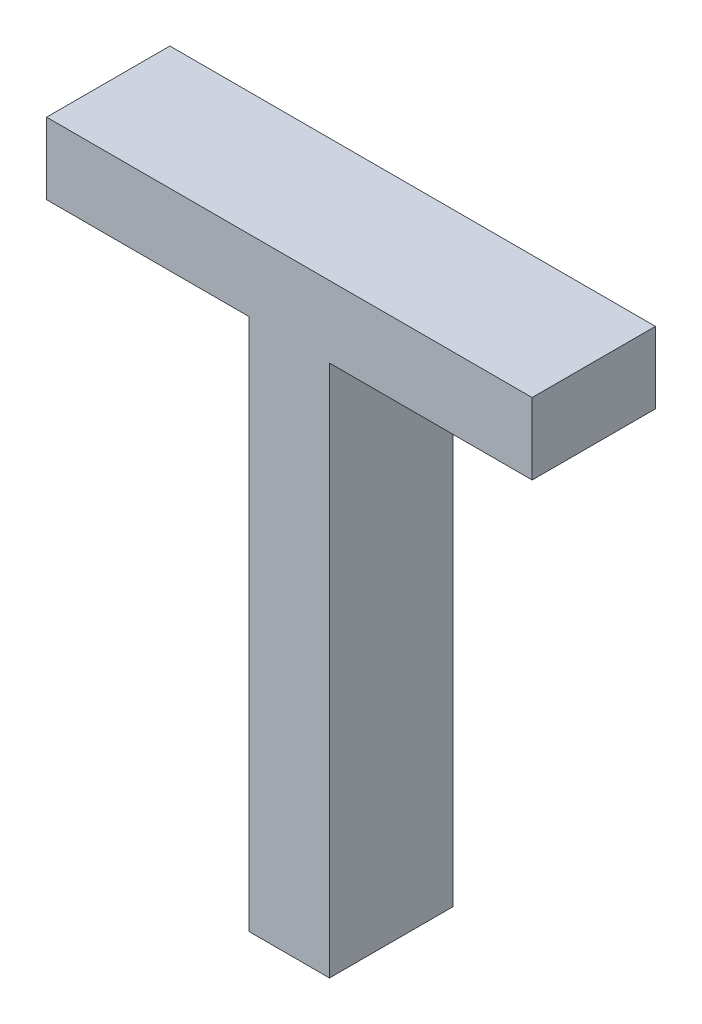
ISO-10303-21;
HEADER;
FILE_DESCRIPTION(('STEP AP214'),'2;1');
FILE_NAME('part.step','',(''),(''),'','','');
FILE_SCHEMA(('AUTOMOTIVE_DESIGN { 1 0 10303 214 1 1 1 1 }'));
ENDSEC;
DATA;
#1=APPLICATION_CONTEXT('core data for automotive mechanical design processes');
#2=APPLICATION_PROTOCOL_DEFINITION('international standard','automotive_design',2000,#1);
#3=PRODUCT_CONTEXT('',#1,'mechanical');
#4=PRODUCT('Part','Part','',(#3));
#5=PRODUCT_RELATED_PRODUCT_CATEGORY('part','',(#4));
#6=PRODUCT_DEFINITION_FORMATION('','',#4);
#7=PRODUCT_DEFINITION_CONTEXT('part definition',#1,'design');
#8=PRODUCT_DEFINITION('design','',#6,#7);
#9=PRODUCT_DEFINITION_SHAPE('','',#8);
#10=(LENGTH_UNIT() NAMED_UNIT(*) SI_UNIT(.MILLI.,.METRE.));
#11=(NAMED_UNIT(*) PLANE_ANGLE_UNIT() SI_UNIT($,.RADIAN.));
#12=(NAMED_UNIT(*) SI_UNIT($,.STERADIAN.) SOLID_ANGLE_UNIT());
#13=UNCERTAINTY_MEASURE_WITH_UNIT(LENGTH_MEASURE(1.E-05),#10,'distance_accuracy_value','');
#14=(GEOMETRIC_REPRESENTATION_CONTEXT(3) GLOBAL_UNCERTAINTY_ASSIGNED_CONTEXT((#13)) GLOBAL_UNIT_ASSIGNED_CONTEXT((#10,
#11,#12)) REPRESENTATION_CONTEXT('',''));
#15=CARTESIAN_POINT('',(0.,0.,0.));
#16=DIRECTION('',(0.,0.,1.));
#17=DIRECTION('',(1.,0.,0.));
#18=AXIS2_PLACEMENT_3D('',#15,#16,#17);
#19=CARTESIAN_POINT('',(-1.06893357572,-0.89500541970053,0.));
#20=DIRECTION('',(0.,-1.,0.));
#21=DIRECTION('',(1.,0.,0.));
#22=AXIS2_PLACEMENT_3D('',#19,#20,#21);
#23=PLANE('',#22);
#24=DIRECTION('',(-1.,0.,0.));
#25=VECTOR('',#24,1.);
#26=CARTESIAN_POINT('',(-0.904541359597708,-0.89500541970053,0.));
#27=LINE('',#26,#25);
#28=CARTESIAN_POINT('',(-0.904541359597708,-0.89500541970053,0.));
#29=VERTEX_POINT('',#28);
#30=CARTESIAN_POINT('',(-1.06893357572,-0.89500541970053,0.));
#31=VERTEX_POINT('',#30);
#32=EDGE_CURVE('E11',#29,#31,#27,.T.);
#33=ORIENTED_EDGE('',*,*,#32,.F.);
#34=DIRECTION('',(0.,0.,1.));
#35=VECTOR('',#34,1.);
#36=CARTESIAN_POINT('',(-0.904541359597708,-0.89500541970053,0.));
#37=LINE('',#36,#35);
#38=CARTESIAN_POINT('',(-0.904541359597708,-0.89500541970053,0.1));
#39=VERTEX_POINT('',#38);
#40=EDGE_CURVE('E24',#29,#39,#37,.T.);
#41=ORIENTED_EDGE('',*,*,#40,.T.);
#42=DIRECTION('',(1.,0.,0.));
#43=VECTOR('',#42,1.);
#44=CARTESIAN_POINT('',(-0.904541359597708,-0.89500541970053,0.1));
#45=LINE('',#44,#43);
#46=CARTESIAN_POINT('',(-1.06893357572,-0.89500541970053,0.1));
#47=VERTEX_POINT('',#46);
#48=EDGE_CURVE('E100',#47,#39,#45,.T.);
#49=ORIENTED_EDGE('',*,*,#48,.F.);
#50=DIRECTION('',(0.,0.,1.));
#51=VECTOR('',#50,1.);
#52=CARTESIAN_POINT('',(-1.06893357572,-0.89500541970053,0.));
#53=LINE('',#52,#51);
#54=EDGE_CURVE('E141',#31,#47,#53,.T.);
#55=ORIENTED_EDGE('',*,*,#54,.F.);
#56=EDGE_LOOP('',(#33,#41,#49,#55));
#57=FACE_BOUND('',#56,.T.);
#58=ADVANCED_FACE('F17',(#57),#23,.T.);
#59=CARTESIAN_POINT('',(-1.06893357572,-0.837031353145417,0.));
#60=DIRECTION('',(-1.,0.,0.));
#61=DIRECTION('',(0.,-1.,0.));
#62=AXIS2_PLACEMENT_3D('',#59,#60,#61);
#63=PLANE('',#62);
#64=DIRECTION('',(0.,1.,0.));
#65=VECTOR('',#64,1.);
#66=CARTESIAN_POINT('',(-1.06893357572,-0.89500541970053,0.));
#67=LINE('',#66,#65);
#68=CARTESIAN_POINT('',(-1.06893357572,-0.837031353145417,0.));
#69=VERTEX_POINT('',#68);
#70=EDGE_CURVE('E139',#31,#69,#67,.T.);
#71=ORIENTED_EDGE('',*,*,#70,.F.);
#72=ORIENTED_EDGE('',*,*,#54,.T.);
#73=DIRECTION('',(0.,-1.,0.));
#74=VECTOR('',#73,1.);
#75=CARTESIAN_POINT('',(-1.06893357572,-0.89500541970053,0.1));
#76=LINE('',#75,#74);
#77=CARTESIAN_POINT('',(-1.06893357572,-0.837031353145417,0.1));
#78=VERTEX_POINT('',#77);
#79=EDGE_CURVE('E137',#78,#47,#76,.T.);
#80=ORIENTED_EDGE('',*,*,#79,.F.);
#81=DIRECTION('',(0.,0.,1.));
#82=VECTOR('',#81,1.);
#83=CARTESIAN_POINT('',(-1.06893357572,-0.837031353145417,0.));
#84=LINE('',#83,#82);
#85=EDGE_CURVE('E134',#69,#78,#84,.T.);
#86=ORIENTED_EDGE('',*,*,#85,.F.);
#87=EDGE_LOOP('',(#71,#72,#80,#86));
#88=FACE_BOUND('',#87,.T.);
#89=ADVANCED_FACE('F163',(#88),#63,.T.);
#90=CARTESIAN_POINT('',(-0.67502758926308,-0.837031353145417,0.));
#91=DIRECTION('',(0.,1.,0.));
#92=DIRECTION('',(-1.,0.,0.));
#93=AXIS2_PLACEMENT_3D('',#90,#91,#92);
#94=PLANE('',#93);
#95=DIRECTION('',(1.,0.,0.));
#96=VECTOR('',#95,1.);
#97=CARTESIAN_POINT('',(-1.06893357572,-0.837031353145417,0.));
#98=LINE('',#97,#96);
#99=CARTESIAN_POINT('',(-0.67502758926308,-0.837031353145417,0.));
#100=VERTEX_POINT('',#99);
#101=EDGE_CURVE('E132',#69,#100,#98,.T.);
#102=ORIENTED_EDGE('',*,*,#101,.F.);
#103=ORIENTED_EDGE('',*,*,#85,.T.);
#104=DIRECTION('',(-1.,0.,0.));
#105=VECTOR('',#104,1.);
#106=CARTESIAN_POINT('',(-1.06893357572,-0.837031353145417,0.1));
#107=LINE('',#106,#105);
#108=CARTESIAN_POINT('',(-0.67502758926308,-0.837031353145417,0.1));
#109=VERTEX_POINT('',#108);
#110=EDGE_CURVE('E129',#109,#78,#107,.T.);
#111=ORIENTED_EDGE('',*,*,#110,.F.);
#112=DIRECTION('',(0.,0.,1.));
#113=VECTOR('',#112,1.);
#114=CARTESIAN_POINT('',(-0.67502758926308,-0.837031353145417,0.));
#115=LINE('',#114,#113);
#116=EDGE_CURVE('E126',#100,#109,#115,.T.);
#117=ORIENTED_EDGE('',*,*,#116,.F.);
#118=EDGE_LOOP('',(#102,#103,#111,#117));
#119=FACE_BOUND('',#118,.T.);
#120=ADVANCED_FACE('F159',(#119),#94,.T.);
#121=CARTESIAN_POINT('',(-0.67502758926308,-0.89500541970053,0.));
#122=DIRECTION('',(1.,0.,0.));
#123=DIRECTION('',(0.,1.,0.));
#124=AXIS2_PLACEMENT_3D('',#121,#122,#123);
#125=PLANE('',#124);
#126=DIRECTION('',(0.,-1.,0.));
#127=VECTOR('',#126,1.);
#128=CARTESIAN_POINT('',(-0.67502758926308,-0.837031353145417,0.));
#129=LINE('',#128,#127);
#130=CARTESIAN_POINT('',(-0.67502758926308,-0.89500541970053,0.));
#131=VERTEX_POINT('',#130);
#132=EDGE_CURVE('E124',#100,#131,#129,.T.);
#133=ORIENTED_EDGE('',*,*,#132,.F.);
#134=ORIENTED_EDGE('',*,*,#116,.T.);
#135=DIRECTION('',(0.,1.,0.));
#136=VECTOR('',#135,1.);
#137=CARTESIAN_POINT('',(-0.67502758926308,-0.837031353145417,0.1));
#138=LINE('',#137,#136);
#139=CARTESIAN_POINT('',(-0.67502758926308,-0.89500541970053,0.1));
#140=VERTEX_POINT('',#139);
#141=EDGE_CURVE('E121',#140,#109,#138,.T.);
#142=ORIENTED_EDGE('',*,*,#141,.F.);
#143=DIRECTION('',(0.,0.,1.));
#144=VECTOR('',#143,1.);
#145=CARTESIAN_POINT('',(-0.67502758926308,-0.89500541970053,0.));
#146=LINE('',#145,#144);
#147=EDGE_CURVE('E118',#131,#140,#146,.T.);
#148=ORIENTED_EDGE('',*,*,#147,.F.);
#149=EDGE_LOOP('',(#133,#134,#142,#148));
#150=FACE_BOUND('',#149,.T.);
#151=ADVANCED_FACE('F155',(#150),#125,.T.);
#152=CARTESIAN_POINT('',(-0.839419805385115,-0.89500541970053,0.));
#153=DIRECTION('',(0.,-1.,0.));
#154=DIRECTION('',(1.,0.,0.));
#155=AXIS2_PLACEMENT_3D('',#152,#153,#154);
#156=PLANE('',#155);
#157=DIRECTION('',(-1.,0.,0.));
#158=VECTOR('',#157,1.);
#159=CARTESIAN_POINT('',(-0.67502758926308,-0.89500541970053,0.));
#160=LINE('',#159,#158);
#161=CARTESIAN_POINT('',(-0.839419805385115,-0.89500541970053,0.));
#162=VERTEX_POINT('',#161);
#163=EDGE_CURVE('E116',#131,#162,#160,.T.);
#164=ORIENTED_EDGE('',*,*,#163,.F.);
#165=ORIENTED_EDGE('',*,*,#147,.T.);
#166=DIRECTION('',(1.,0.,0.));
#167=VECTOR('',#166,1.);
#168=CARTESIAN_POINT('',(-0.67502758926308,-0.89500541970053,0.1));
#169=LINE('',#168,#167);
#170=CARTESIAN_POINT('',(-0.839419805385115,-0.89500541970053,0.1));
#171=VERTEX_POINT('',#170);
#172=EDGE_CURVE('E113',#171,#140,#169,.T.);
#173=ORIENTED_EDGE('',*,*,#172,.F.);
#174=DIRECTION('',(0.,0.,1.));
#175=VECTOR('',#174,1.);
#176=CARTESIAN_POINT('',(-0.839419805385115,-0.89500541970053,0.));
#177=LINE('',#176,#175);
#178=EDGE_CURVE('E110',#162,#171,#177,.T.);
#179=ORIENTED_EDGE('',*,*,#178,.F.);
#180=EDGE_LOOP('',(#164,#165,#173,#179));
#181=FACE_BOUND('',#180,.T.);
#182=ADVANCED_FACE('F151',(#181),#156,.T.);
#183=CARTESIAN_POINT('',(-0.839419805385115,-1.32703134033,0.));
#184=DIRECTION('',(1.,0.,0.));
#185=DIRECTION('',(0.,1.,0.));
#186=AXIS2_PLACEMENT_3D('',#183,#184,#185);
#187=PLANE('',#186);
#188=DIRECTION('',(0.,-1.,0.));
#189=VECTOR('',#188,1.);
#190=CARTESIAN_POINT('',(-0.839419805385115,-0.89500541970053,0.));
#191=LINE('',#190,#189);
#192=CARTESIAN_POINT('',(-0.839419805385115,-1.32703134033,0.));
#193=VERTEX_POINT('',#192);
#194=EDGE_CURVE('E108',#162,#193,#191,.T.);
#195=ORIENTED_EDGE('',*,*,#194,.F.);
#196=ORIENTED_EDGE('',*,*,#178,.T.);
#197=DIRECTION('',(0.,1.,0.));
#198=VECTOR('',#197,1.);
#199=CARTESIAN_POINT('',(-0.839419805385115,-0.89500541970053,0.1));
#200=LINE('',#199,#198);
#201=CARTESIAN_POINT('',(-0.839419805385115,-1.32703134033,0.1));
#202=VERTEX_POINT('',#201);
#203=EDGE_CURVE('E106',#202,#171,#200,.T.);
#204=ORIENTED_EDGE('',*,*,#203,.F.);
#205=DIRECTION('',(0.,0.,1.));
#206=VECTOR('',#205,1.);
#207=CARTESIAN_POINT('',(-0.839419805385115,-1.32703134033,0.));
#208=LINE('',#207,#206);
#209=EDGE_CURVE('E85',#193,#202,#208,.T.);
#210=ORIENTED_EDGE('',*,*,#209,.F.);
#211=EDGE_LOOP('',(#195,#196,#204,#210));
#212=FACE_BOUND('',#211,.T.);
#213=ADVANCED_FACE('F149',(#212),#187,.T.);
#214=CARTESIAN_POINT('',(-0.904541359597708,-1.32703134033,0.));
#215=DIRECTION('',(0.,-1.,0.));
#216=DIRECTION('',(1.,0.,0.));
#217=AXIS2_PLACEMENT_3D('',#214,#215,#216);
#218=PLANE('',#217);
#219=DIRECTION('',(-1.,0.,0.));
#220=VECTOR('',#219,1.);
#221=CARTESIAN_POINT('',(-0.839419805385115,-1.32703134033,0.));
#222=LINE('',#221,#220);
#223=CARTESIAN_POINT('',(-0.904541359597708,-1.32703134033,0.));
#224=VERTEX_POINT('',#223);
#225=EDGE_CURVE('E89',#193,#224,#222,.T.);
#226=ORIENTED_EDGE('',*,*,#225,.F.);
#227=ORIENTED_EDGE('',*,*,#209,.T.);
#228=DIRECTION('',(1.,0.,0.));
#229=VECTOR('',#228,1.);
#230=CARTESIAN_POINT('',(-0.839419805385115,-1.32703134033,0.1));
#231=LINE('',#230,#229);
#232=CARTESIAN_POINT('',(-0.904541359597708,-1.32703134033,0.1));
#233=VERTEX_POINT('',#232);
#234=EDGE_CURVE('E78',#233,#202,#231,.T.);
#235=ORIENTED_EDGE('',*,*,#234,.F.);
#236=DIRECTION('',(0.,0.,1.));
#237=VECTOR('',#236,1.);
#238=CARTESIAN_POINT('',(-0.904541359597708,-1.32703134033,0.));
#239=LINE('',#238,#237);
#240=EDGE_CURVE('E82',#224,#233,#239,.T.);
#241=ORIENTED_EDGE('',*,*,#240,.F.);
#242=EDGE_LOOP('',(#226,#227,#235,#241));
#243=FACE_BOUND('',#242,.T.);
#244=ADVANCED_FACE('F81',(#243),#218,.T.);
#245=CARTESIAN_POINT('',(-0.904541359597708,-0.89500541970053,0.));
#246=DIRECTION('',(-1.,0.,0.));
#247=DIRECTION('',(0.,-1.,0.));
#248=AXIS2_PLACEMENT_3D('',#245,#246,#247);
#249=PLANE('',#248);
#250=DIRECTION('',(0.,1.,0.));
#251=VECTOR('',#250,1.);
#252=CARTESIAN_POINT('',(-0.904541359597708,-1.32703134033,0.));
#253=LINE('',#252,#251);
#254=EDGE_CURVE('E95',#224,#29,#253,.T.);
#255=ORIENTED_EDGE('',*,*,#254,.F.);
#256=ORIENTED_EDGE('',*,*,#240,.T.);
#257=DIRECTION('',(0.,-1.,0.));
#258=VECTOR('',#257,1.);
#259=CARTESIAN_POINT('',(-0.904541359597708,-1.32703134033,0.1));
#260=LINE('',#259,#258);
#261=EDGE_CURVE('E94',#39,#233,#260,.T.);
#262=ORIENTED_EDGE('',*,*,#261,.F.);
#263=ORIENTED_EDGE('',*,*,#40,.F.);
#264=EDGE_LOOP('',(#255,#256,#262,#263));
#265=FACE_BOUND('',#264,.T.);
#266=ADVANCED_FACE('F93',(#265),#249,.T.);
#267=CARTESIAN_POINT('',(-0.871980582491411,-1.001681512443,0.));
#268=DIRECTION('',(0.,0.,1.));
#269=DIRECTION('',(1.,0.,0.));
#270=AXIS2_PLACEMENT_3D('',#267,#268,#269);
#271=PLANE('',#270);
#272=ORIENTED_EDGE('',*,*,#254,.T.);
#273=ORIENTED_EDGE('',*,*,#32,.T.);
#274=ORIENTED_EDGE('',*,*,#70,.T.);
#275=ORIENTED_EDGE('',*,*,#101,.T.);
#276=ORIENTED_EDGE('',*,*,#132,.T.);
#277=ORIENTED_EDGE('',*,*,#163,.T.);
#278=ORIENTED_EDGE('',*,*,#194,.T.);
#279=ORIENTED_EDGE('',*,*,#225,.T.);
#280=EDGE_LOOP('',(#272,#273,#274,#275,#276,#277,#278,#279));
#281=FACE_BOUND('',#280,.T.);
#282=ADVANCED_FACE('F144',(#281),#271,.F.);
#283=CARTESIAN_POINT('',(-0.871980582491411,-1.001681512443,0.1));
#284=DIRECTION('',(0.,0.,1.));
#285=DIRECTION('',(1.,0.,0.));
#286=AXIS2_PLACEMENT_3D('',#283,#284,#285);
#287=PLANE('',#286);
#288=ORIENTED_EDGE('',*,*,#261,.T.);
#289=ORIENTED_EDGE('',*,*,#234,.T.);
#290=ORIENTED_EDGE('',*,*,#203,.T.);
#291=ORIENTED_EDGE('',*,*,#172,.T.);
#292=ORIENTED_EDGE('',*,*,#141,.T.);
#293=ORIENTED_EDGE('',*,*,#110,.T.);
#294=ORIENTED_EDGE('',*,*,#79,.T.);
#295=ORIENTED_EDGE('',*,*,#48,.T.);
#296=EDGE_LOOP('',(#288,#289,#290,#291,#292,#293,#294,#295));
#297=FACE_BOUND('',#296,.T.);
#298=ADVANCED_FACE('F98',(#297),#287,.T.);
#299=CLOSED_SHELL('',(#58,#89,#120,#151,#182,#213,#244,#266,#282,#298));
#300=MANIFOLD_SOLID_BREP('B1',#299);
#301=ADVANCED_BREP_SHAPE_REPRESENTATION('',(#18,#300),#14);
#302=SHAPE_DEFINITION_REPRESENTATION(#9,#301);
ENDSEC;
END-ISO-10303-21;
